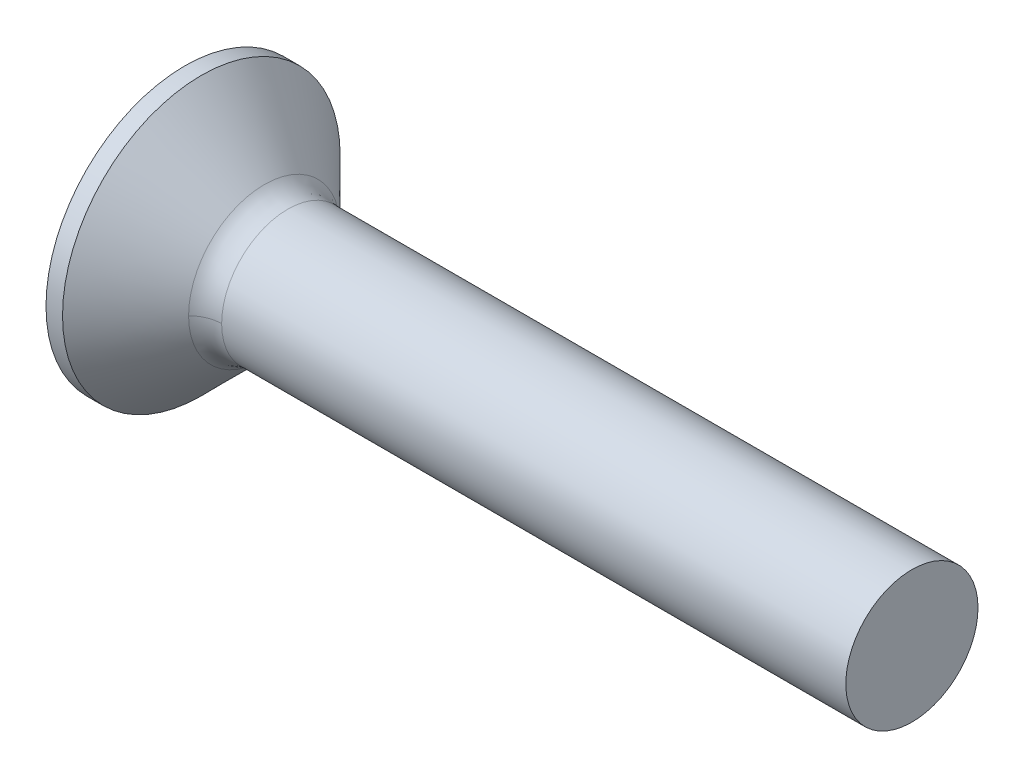
ISO-10303-21;
HEADER;
FILE_DESCRIPTION(('STEP AP214'),'2;1');
FILE_NAME('part.step','',(''),(''),'','','');
FILE_SCHEMA(('AUTOMOTIVE_DESIGN { 1 0 10303 214 1 1 1 1 }'));
ENDSEC;
DATA;
#1=APPLICATION_CONTEXT('core data for automotive mechanical design processes');
#2=APPLICATION_PROTOCOL_DEFINITION('international standard','automotive_design',2000,#1);
#3=PRODUCT_CONTEXT('',#1,'mechanical');
#4=PRODUCT('Part','Part','',(#3));
#5=PRODUCT_RELATED_PRODUCT_CATEGORY('part','',(#4));
#6=PRODUCT_DEFINITION_FORMATION('','',#4);
#7=PRODUCT_DEFINITION_CONTEXT('part definition',#1,'design');
#8=PRODUCT_DEFINITION('design','',#6,#7);
#9=PRODUCT_DEFINITION_SHAPE('','',#8);
#10=(LENGTH_UNIT() NAMED_UNIT(*) SI_UNIT(.MILLI.,.METRE.));
#11=(NAMED_UNIT(*) PLANE_ANGLE_UNIT() SI_UNIT($,.RADIAN.));
#12=(NAMED_UNIT(*) SI_UNIT($,.STERADIAN.) SOLID_ANGLE_UNIT());
#13=UNCERTAINTY_MEASURE_WITH_UNIT(LENGTH_MEASURE(1.E-05),#10,'distance_accuracy_value','');
#14=(GEOMETRIC_REPRESENTATION_CONTEXT(3) GLOBAL_UNCERTAINTY_ASSIGNED_CONTEXT((#13)) GLOBAL_UNIT_ASSIGNED_CONTEXT((#10,
#11,#12)) REPRESENTATION_CONTEXT('',''));
#15=CARTESIAN_POINT('',(0.,0.,0.));
#16=DIRECTION('',(0.,0.,1.));
#17=DIRECTION('',(1.,0.,0.));
#18=AXIS2_PLACEMENT_3D('',#15,#16,#17);
#19=CARTESIAN_POINT('',(25.,0.,0.));
#20=DIRECTION('',(-1.,0.,0.));
#21=DIRECTION('',(0.,0.,1.));
#22=AXIS2_PLACEMENT_3D('',#19,#20,#21);
#23=CYLINDRICAL_SURFACE('',#22,2.);
#24=CARTESIAN_POINT('',(3.11421356207373,0.,0.));
#25=DIRECTION('',(1.,0.,0.));
#26=DIRECTION('',(0.,1.,0.));
#27=AXIS2_PLACEMENT_3D('',#24,#25,#26);
#28=CIRCLE('',#27,2.00000000028272);
#29=CARTESIAN_POINT('',(3.11421356205332,-2.05103428515331E-10,-2.00000000021204));
#30=VERTEX_POINT('',#29);
#31=CARTESIAN_POINT('',(3.11421356207076,-8.9793628428733E-11,2.00000000021204));
#32=VERTEX_POINT('',#31);
#33=EDGE_CURVE('E358',#30,#32,#28,.T.);
#34=ORIENTED_EDGE('',*,*,#33,.T.);
#35=CARTESIAN_POINT('',(3.11421356207373,0.,0.));
#36=DIRECTION('',(1.,0.,0.));
#37=DIRECTION('',(0.,1.,0.));
#38=AXIS2_PLACEMENT_3D('',#35,#36,#37);
#39=CIRCLE('',#38,2.00000000028272);
#40=EDGE_CURVE('E347',#32,#30,#39,.T.);
#41=ORIENTED_EDGE('',*,*,#40,.T.);
#42=EDGE_LOOP('',(#34,#41));
#43=FACE_BOUND('',#42,.T.);
#44=CARTESIAN_POINT('',(22.,0.,0.));
#45=DIRECTION('',(1.,0.,0.));
#46=DIRECTION('',(0.,0.,-1.));
#47=AXIS2_PLACEMENT_3D('',#44,#45,#46);
#48=CIRCLE('',#47,2.);
#49=CARTESIAN_POINT('',(22.,0.,-2.));
#50=VERTEX_POINT('',#49);
#51=EDGE_CURVE('E34',#50,#50,#48,.T.);
#52=ORIENTED_EDGE('',*,*,#51,.F.);
#53=EDGE_LOOP('',(#52));
#54=FACE_BOUND('',#53,.T.);
#55=ADVANCED_FACE('F30',(#43,#54),#23,.T.);
#56=CARTESIAN_POINT('',(2.51,0.,0.));
#57=DIRECTION('',(-1.,0.,0.));
#58=DIRECTION('',(0.,0.,1.));
#59=AXIS2_PLACEMENT_3D('',#56,#57,#58);
#60=CONICAL_SURFACE('',#59,0.851,0.0698131700884116);
#61=CARTESIAN_POINT('',(2.51000000000001,0.,0.));
#62=DIRECTION('',(-1.,0.,0.));
#63=DIRECTION('',(0.,0.,1.));
#64=AXIS2_PLACEMENT_3D('',#61,#62,#63);
#65=CIRCLE('',#64,0.851);
#66=CARTESIAN_POINT('',(2.51000000000001,0.515000000128447,-0.677477674811281));
#67=VERTEX_POINT('',#66);
#68=CARTESIAN_POINT('',(2.50999999998821,0.677477674911375,-0.514999999998138));
#69=VERTEX_POINT('',#68);
#70=EDGE_CURVE('E140',#67,#69,#65,.F.);
#71=ORIENTED_EDGE('',*,*,#70,.T.);
#72=CARTESIAN_POINT('',(-7.25470712172385E-11,0.887981255320598,-0.514999999738052));
#73=CARTESIAN_POINT('',(0.318819879636719,0.862192153268574,-0.51499999990922));
#74=CARTESIAN_POINT('',(0.637620357667007,0.836153848252877,-0.514999999976439));
#75=CARTESIAN_POINT('',(1.27515765628023,0.783330183982056,-0.515000000023561));
#76=CARTESIAN_POINT('',(1.59389447718419,0.756544828595421,-0.515000000003464));
#77=CARTESIAN_POINT('',(2.01216629989946,0.720736675273492,-0.514999999998918));
#78=CARTESIAN_POINT('',(2.11173974714975,0.712163242481372,-0.514999999999459));
#79=CARTESIAN_POINT('',(2.31087725771429,0.694906260205415,-0.515000000000541));
#80=CARTESIAN_POINT('',(2.41044132101322,0.686222710544853,-0.515000000001082));
#81=CARTESIAN_POINT('',(2.50999999997648,0.677477674910992,-0.515));
#82=B_SPLINE_CURVE_WITH_KNOTS('',3,(#72,#73,#74,#75,#76,#77,#78,#79,#80,#81),.UNSPECIFIED.,.F.,
.F.,(4,2,2,2,4),(0.,0.959584754186786,1.91916454022962,2.21899005858181,2.51881605817835),.UNSPECIFIED.);
#83=CARTESIAN_POINT('',(0.,0.887981255466366,-0.515));
#84=VERTEX_POINT('',#83);
#85=EDGE_CURVE('E133',#84,#69,#82,.T.);
#86=ORIENTED_EDGE('',*,*,#85,.F.);
#87=CARTESIAN_POINT('',(0.,0.,0.));
#88=DIRECTION('',(-1.,0.,0.));
#89=DIRECTION('',(0.,0.,1.));
#90=AXIS2_PLACEMENT_3D('',#87,#88,#89);
#91=CIRCLE('',#90,1.026516298);
#92=CARTESIAN_POINT('',(-2.85935113966268E-11,0.515,-0.887981255468678));
#93=VERTEX_POINT('',#92);
#94=EDGE_CURVE('E144',#84,#93,#91,.T.);
#95=ORIENTED_EDGE('',*,*,#94,.T.);
#96=CARTESIAN_POINT('',(2.50999999998217,0.515,-0.677477674910489));
#97=CARTESIAN_POINT('',(2.24584461878122,0.515,-0.700667679814435));
#98=CARTESIAN_POINT('',(1.98165392257068,0.515,-0.723450461944113));
#99=CARTESIAN_POINT('',(1.45321766745748,0.515,-0.768360402906354));
#100=CARTESIAN_POINT('',(1.18897210874822,0.515,-0.79048756401168));
#101=CARTESIAN_POINT('',(0.770601353287124,0.515,-0.825124883970429));
#102=CARTESIAN_POINT('',(0.616489661388993,0.515,-0.837798921148617));
#103=CARTESIAN_POINT('',(0.308253737302725,0.515,-0.862997437699919));
#104=CARTESIAN_POINT('',(0.154129505090094,0.515,-0.875521916773493));
#105=CARTESIAN_POINT('',(-5.6932000135886E-11,0.515,-0.887981255470971));
#106=B_SPLINE_CURVE_WITH_KNOTS('',3,(#96,#97,#98,#99,#100,#101,#102,#103,#104,#105),
.UNSPECIFIED.,.F.,.F.,(4,2,2,2,4),(0.,0.795513110102209,1.59102346217274,2.05491931016661,
2.51881608711106),.UNSPECIFIED.);
#107=EDGE_CURVE('E166',#67,#93,#106,.T.);
#108=ORIENTED_EDGE('',*,*,#107,.F.);
#109=EDGE_LOOP('',(#71,#86,#95,#108));
#110=FACE_BOUND('',#109,.T.);
#111=ADVANCED_FACE('F154',(#110),#60,.F.);
#112=CARTESIAN_POINT('',(0.,0.668342541,-0.515));
#113=DIRECTION('',(0.,0.,1.));
#114=DIRECTION('',(1.,0.,0.));
#115=AXIS2_PLACEMENT_3D('',#112,#113,#114);
#116=PLANE('',#115);
#117=DIRECTION('',(0.,1.,0.));
#118=VECTOR('',#117,1.);
#119=CARTESIAN_POINT('',(2.51,1.4387388375,-0.515));
#120=LINE('',#119,#118);
#121=CARTESIAN_POINT('',(2.51,0.948560206845572,-0.515));
#122=VERTEX_POINT('',#121);
#123=EDGE_CURVE('E156',#69,#122,#120,.T.);
#124=ORIENTED_EDGE('',*,*,#123,.T.);
#125=DIRECTION('',(0.894934367754668,-0.446197800769517,0.));
#126=VECTOR('',#125,1.);
#127=CARTESIAN_POINT('',(1.255,1.5742801035,-0.515));
#128=LINE('',#127,#126);
#129=CARTESIAN_POINT('',(0.,2.19999999989061,-0.515));
#130=VERTEX_POINT('',#129);
#131=EDGE_CURVE('E137',#130,#122,#128,.T.);
#132=ORIENTED_EDGE('',*,*,#131,.F.);
#133=DIRECTION('',(0.,-1.,0.));
#134=VECTOR('',#133,1.);
#135=CARTESIAN_POINT('',(0.,1.4387388375,-0.515));
#136=LINE('',#135,#134);
#137=EDGE_CURVE('E128',#130,#84,#136,.T.);
#138=ORIENTED_EDGE('',*,*,#137,.T.);
#139=ORIENTED_EDGE('',*,*,#85,.T.);
#140=EDGE_LOOP('',(#124,#132,#138,#139));
#141=FACE_BOUND('',#140,.T.);
#142=ADVANCED_FACE('F131',(#141),#116,.T.);
#143=CARTESIAN_POINT('',(0.,0.515,-2.209135134));
#144=DIRECTION('',(0.,-1.,0.));
#145=DIRECTION('',(1.,0.,0.));
#146=AXIS2_PLACEMENT_3D('',#143,#144,#145);
#147=PLANE('',#146);
#148=DIRECTION('',(0.,0.,-1.));
#149=VECTOR('',#148,1.);
#150=CARTESIAN_POINT('',(0.,0.515,-1.4387388375));
#151=LINE('',#150,#149);
#152=CARTESIAN_POINT('',(0.,0.515,-2.19999999989061));
#153=VERTEX_POINT('',#152);
#154=EDGE_CURVE('E150',#93,#153,#151,.T.);
#155=ORIENTED_EDGE('',*,*,#154,.T.);
#156=DIRECTION('',(-0.894934367754668,0.,-0.446197800769517));
#157=VECTOR('',#156,1.);
#158=CARTESIAN_POINT('',(1.255,0.515,-1.5742801035));
#159=LINE('',#158,#157);
#160=CARTESIAN_POINT('',(2.51,0.515,-0.948560206845572));
#161=VERTEX_POINT('',#160);
#162=EDGE_CURVE('E378',#161,#153,#159,.T.);
#163=ORIENTED_EDGE('',*,*,#162,.F.);
#164=DIRECTION('',(0.,0.,1.));
#165=VECTOR('',#164,1.);
#166=CARTESIAN_POINT('',(2.51,0.515,-1.4387388375));
#167=LINE('',#166,#165);
#168=EDGE_CURVE('E158',#161,#67,#167,.T.);
#169=ORIENTED_EDGE('',*,*,#168,.T.);
#170=ORIENTED_EDGE('',*,*,#107,.T.);
#171=EDGE_LOOP('',(#155,#163,#169,#170));
#172=FACE_BOUND('',#171,.T.);
#173=ADVANCED_FACE('F653',(#172),#147,.T.);
#174=CARTESIAN_POINT('',(0.,2.2,-0.515));
#175=DIRECTION('',(-0.446197800769517,-0.894934367754668,0.));
#176=DIRECTION('',(0.894934367754668,-0.446197800769517,0.));
#177=AXIS2_PLACEMENT_3D('',#174,#175,#176);
#178=PLANE('',#177);
#179=ORIENTED_EDGE('',*,*,#131,.T.);
#180=DIRECTION('',(0.,0.,1.));
#181=VECTOR('',#180,1.);
#182=CARTESIAN_POINT('',(2.51,0.948560207,0.));
#183=LINE('',#182,#181);
#184=CARTESIAN_POINT('',(2.51,0.948560206768358,0.515));
#185=VERTEX_POINT('',#184);
#186=EDGE_CURVE('E394',#122,#185,#183,.T.);
#187=ORIENTED_EDGE('',*,*,#186,.T.);
#188=DIRECTION('',(0.894934367735432,-0.446197800808098,0.));
#189=VECTOR('',#188,1.);
#190=CARTESIAN_POINT('',(0.,2.19999999967182,0.515));
#191=LINE('',#190,#189);
#192=CARTESIAN_POINT('',(0.,2.19999999983591,0.515));
#193=VERTEX_POINT('',#192);
#194=EDGE_CURVE('E368',#193,#185,#191,.T.);
#195=ORIENTED_EDGE('',*,*,#194,.F.);
#196=DIRECTION('',(0.,0.,-1.));
#197=VECTOR('',#196,1.);
#198=CARTESIAN_POINT('',(0.,2.2,0.));
#199=LINE('',#198,#197);
#200=EDGE_CURVE('E389',#193,#130,#199,.T.);
#201=ORIENTED_EDGE('',*,*,#200,.T.);
#202=EDGE_LOOP('',(#179,#187,#195,#201));
#203=FACE_BOUND('',#202,.T.);
#204=ADVANCED_FACE('F525',(#203),#178,.T.);
#205=CARTESIAN_POINT('',(2.51,0.515,-0.948560207));
#206=DIRECTION('',(-0.446197800769517,0.,0.894934367754668));
#207=DIRECTION('',(-0.894934367754668,0.,-0.446197800769517));
#208=AXIS2_PLACEMENT_3D('',#205,#206,#207);
#209=PLANE('',#208);
#210=DIRECTION('',(-0.894934367735432,0.,-0.446197800808098));
#211=VECTOR('',#210,1.);
#212=CARTESIAN_POINT('',(2.51,-0.515,-0.948560206536716));
#213=LINE('',#212,#211);
#214=CARTESIAN_POINT('',(2.51,-0.515,-0.948560206768358));
#215=VERTEX_POINT('',#214);
#216=CARTESIAN_POINT('',(0.,-0.515,-2.19999999983591));
#217=VERTEX_POINT('',#216);
#218=EDGE_CURVE('E333',#215,#217,#213,.T.);
#219=ORIENTED_EDGE('',*,*,#218,.F.);
#220=DIRECTION('',(0.,1.,0.));
#221=VECTOR('',#220,1.);
#222=CARTESIAN_POINT('',(2.51,0.,-0.948560207));
#223=LINE('',#222,#221);
#224=EDGE_CURVE('E371',#215,#161,#223,.T.);
#225=ORIENTED_EDGE('',*,*,#224,.T.);
#226=ORIENTED_EDGE('',*,*,#162,.T.);
#227=DIRECTION('',(0.,-1.,0.));
#228=VECTOR('',#227,1.);
#229=CARTESIAN_POINT('',(0.,0.,-2.2));
#230=LINE('',#229,#228);
#231=EDGE_CURVE('E374',#153,#217,#230,.T.);
#232=ORIENTED_EDGE('',*,*,#231,.T.);
#233=EDGE_LOOP('',(#219,#225,#226,#232));
#234=FACE_BOUND('',#233,.T.);
#235=ADVANCED_FACE('F641',(#234),#209,.T.);
#236=CARTESIAN_POINT('',(0.,0.668342541,0.515));
#237=DIRECTION('',(0.,0.,-1.));
#238=DIRECTION('',(0.,1.,0.));
#239=AXIS2_PLACEMENT_3D('',#236,#237,#238);
#240=PLANE('',#239);
#241=DIRECTION('',(0.,1.,0.));
#242=VECTOR('',#241,1.);
#243=CARTESIAN_POINT('',(0.,1.4387388375,0.515));
#244=LINE('',#243,#242);
#245=CARTESIAN_POINT('',(0.,0.887981255466366,0.515));
#246=VERTEX_POINT('',#245);
#247=EDGE_CURVE('E363',#246,#193,#244,.T.);
#248=ORIENTED_EDGE('',*,*,#247,.T.);
#249=ORIENTED_EDGE('',*,*,#194,.T.);
#250=DIRECTION('',(0.,-1.,0.));
#251=VECTOR('',#250,1.);
#252=CARTESIAN_POINT('',(2.51,1.4387388375,0.515));
#253=LINE('',#252,#251);
#254=CARTESIAN_POINT('',(2.51000000000001,0.677477675015967,0.514999999859184));
#255=VERTEX_POINT('',#254);
#256=EDGE_CURVE('E369',#185,#255,#253,.T.);
#257=ORIENTED_EDGE('',*,*,#256,.T.);
#258=CARTESIAN_POINT('',(-6.23890795979364E-11,0.887981255359255,0.514999999806251));
#259=CARTESIAN_POINT('',(0.318819879644557,0.862192153281618,0.514999999932855));
#260=CARTESIAN_POINT('',(0.637620357673799,0.83615384825587,0.514999999982573));
#261=CARTESIAN_POINT('',(1.27515765628601,0.78333018397802,0.515000000017427));
#262=CARTESIAN_POINT('',(1.59389447719001,0.756544828594407,0.515000000002563));
#263=CARTESIAN_POINT('',(2.01216629990365,0.720736675273295,0.514999999999199));
#264=CARTESIAN_POINT('',(2.11173974715245,0.71216324248122,0.5149999999996));
#265=CARTESIAN_POINT('',(2.31087725771403,0.694906260205355,0.5150000000004));
#266=CARTESIAN_POINT('',(2.41044132101147,0.686222710544842,0.515000000000801));
#267=CARTESIAN_POINT('',(2.50999999997326,0.677477674911275,0.515));
#268=B_SPLINE_CURVE_WITH_KNOTS('',3,(#258,#259,#260,#261,#262,#263,#264,#265,#266,#267),
.UNSPECIFIED.,.F.,.F.,(4,2,2,2,4),(0.,0.959584754186115,1.91916454022833,2.21899005857607,
2.51881605816815),.UNSPECIFIED.);
#269=EDGE_CURVE('E215',#246,#255,#268,.T.);
#270=ORIENTED_EDGE('',*,*,#269,.F.);
#271=EDGE_LOOP('',(#248,#249,#257,#270));
#272=FACE_BOUND('',#271,.T.);
#273=ADVANCED_FACE('F188',(#272),#240,.T.);
#274=CARTESIAN_POINT('',(3.214046979,0.,2.004995835));
#275=CARTESIAN_POINT('',(3.214046979,4.009991669,2.004995835));
#276=CARTESIAN_POINT('',(3.214046979,4.009991669,-2.004995835));
#277=CARTESIAN_POINT('',(3.214046979,0.,-2.004995835));
#278=CARTESIAN_POINT('',(2.873263226,0.,1.970803409));
#279=CARTESIAN_POINT('',(2.873263226,3.941606817,1.970803409));
#280=CARTESIAN_POINT('',(2.873263226,3.941606817,-1.970803409));
#281=CARTESIAN_POINT('',(2.873263226,0.,-1.970803409));
#282=CARTESIAN_POINT('',(2.55683929,0.,2.101870494));
#283=CARTESIAN_POINT('',(2.55683929,4.203740989,2.101870494));
#284=CARTESIAN_POINT('',(2.55683929,4.203740989,-2.101870494));
#285=CARTESIAN_POINT('',(2.55683929,0.,-2.101870494));
#286=CARTESIAN_POINT('',(2.340046484,0.,2.367018693));
#287=CARTESIAN_POINT('',(2.340046484,4.734037387,2.367018693));
#288=CARTESIAN_POINT('',(2.340046484,4.734037387,-2.367018693));
#289=CARTESIAN_POINT('',(2.340046484,0.,-2.367018693));
#290=(BOUNDED_SURFACE() B_SPLINE_SURFACE(3,3,((#274,#275,#276,#277),(#278,#279,#280,#281),(#282,
#283,#284,#285),(#286,#287,#288,#289)),.UNSPECIFIED.,.F.,.F.,
.F.) B_SPLINE_SURFACE_WITH_KNOTS((4,4),(4,4),(0.,1.),(0.,1.),
.UNSPECIFIED.) GEOMETRIC_REPRESENTATION_ITEM() RATIONAL_B_SPLINE_SURFACE(((1.,0.333333333333333,
0.333333333333333,1.),(0.920706259011135,0.306902086337045,0.306902086337045,0.920706259011135),
(0.920706259011135,0.306902086337045,0.306902086337045,0.920706259011135),(1.,0.333333333333333,
0.333333333333333,1.))) REPRESENTATION_ITEM('') SURFACE());
#291=CARTESIAN_POINT('',(2.40710678099998,0.,0.));
#292=DIRECTION('',(-1.,0.,0.));
#293=DIRECTION('',(0.,0.,1.));
#294=AXIS2_PLACEMENT_3D('',#291,#292,#293);
#295=CIRCLE('',#294,2.292893219);
#296=CARTESIAN_POINT('',(2.40710678110323,-7.05420390654683E-10,-2.29289321882874));
#297=VERTEX_POINT('',#296);
#298=CARTESIAN_POINT('',(2.40710678096737,-2.05887201733649E-10,2.2928932189646));
#299=VERTEX_POINT('',#298);
#300=EDGE_CURVE('E319',#297,#299,#295,.F.);
#301=CARTESIAN_POINT('',(3.214046979,0.,2.004995835));
#302=CARTESIAN_POINT('',(2.873263226,0.,1.970803409));
#303=CARTESIAN_POINT('',(2.55683929,0.,2.101870494));
#304=CARTESIAN_POINT('',(2.340046484,0.,2.367018693));
#305=(BOUNDED_CURVE() B_SPLINE_CURVE(3,(#301,#302,#303,#304),.UNSPECIFIED.,.F.,
.F.) B_SPLINE_CURVE_WITH_KNOTS((4,4),(0.,1.),
.UNSPECIFIED.) CURVE() GEOMETRIC_REPRESENTATION_ITEM() RATIONAL_B_SPLINE_CURVE((1.,
0.920706259011135,0.920706259011135,1.)) REPRESENTATION_ITEM(''));
#306=EDGE_CURVE('E352',#299,#32,#305,.F.);
#307=CARTESIAN_POINT('',(3.214046979,0.,-2.004995835));
#308=CARTESIAN_POINT('',(2.873263226,0.,-1.970803409));
#309=CARTESIAN_POINT('',(2.55683929,0.,-2.101870494));
#310=CARTESIAN_POINT('',(2.340046484,0.,-2.367018693));
#311=(BOUNDED_CURVE() B_SPLINE_CURVE(3,(#307,#308,#309,#310),.UNSPECIFIED.,.F.,
.F.) B_SPLINE_CURVE_WITH_KNOTS((4,4),(0.,1.),
.UNSPECIFIED.) CURVE() GEOMETRIC_REPRESENTATION_ITEM() RATIONAL_B_SPLINE_CURVE((1.,
0.920706259011135,0.920706259011135,1.)) REPRESENTATION_ITEM(''));
#312=EDGE_CURVE('E338',#30,#297,#311,.T.);
#313=ORIENTED_EDGE('',*,*,#300,.T.);
#314=ORIENTED_EDGE('',*,*,#306,.T.);
#315=ORIENTED_EDGE('',*,*,#33,.F.);
#316=ORIENTED_EDGE('',*,*,#312,.T.);
#317=EDGE_LOOP('',(#313,#314,#315,#316));
#318=FACE_BOUND('',#317,.T.);
#319=ADVANCED_FACE('F182',(#318),#290,.F.);
#320=CARTESIAN_POINT('',(3.214046979,0.,-2.004995835));
#321=CARTESIAN_POINT('',(3.214046979,-4.009991669,-2.004995835));
#322=CARTESIAN_POINT('',(3.214046979,-4.009991669,2.004995835));
#323=CARTESIAN_POINT('',(3.214046979,0.,2.004995835));
#324=CARTESIAN_POINT('',(2.873263226,0.,-1.970803409));
#325=CARTESIAN_POINT('',(2.873263226,-3.941606817,-1.970803409));
#326=CARTESIAN_POINT('',(2.873263226,-3.941606817,1.970803409));
#327=CARTESIAN_POINT('',(2.873263226,0.,1.970803409));
#328=CARTESIAN_POINT('',(2.55683929,0.,-2.101870494));
#329=CARTESIAN_POINT('',(2.55683929,-4.203740989,-2.101870494));
#330=CARTESIAN_POINT('',(2.55683929,-4.203740989,2.101870494));
#331=CARTESIAN_POINT('',(2.55683929,0.,2.101870494));
#332=CARTESIAN_POINT('',(2.340046484,0.,-2.367018693));
#333=CARTESIAN_POINT('',(2.340046484,-4.734037387,-2.367018693));
#334=CARTESIAN_POINT('',(2.340046484,-4.734037387,2.367018693));
#335=CARTESIAN_POINT('',(2.340046484,0.,2.367018693));
#336=(BOUNDED_SURFACE() B_SPLINE_SURFACE(3,3,((#320,#321,#322,#323),(#324,#325,#326,#327),(#328,
#329,#330,#331),(#332,#333,#334,#335)),.UNSPECIFIED.,.F.,.F.,
.F.) B_SPLINE_SURFACE_WITH_KNOTS((4,4),(4,4),(0.,1.),(0.,1.),
.UNSPECIFIED.) GEOMETRIC_REPRESENTATION_ITEM() RATIONAL_B_SPLINE_SURFACE(((1.,0.333333333333333,
0.333333333333333,1.),(0.920706259011135,0.306902086337045,0.306902086337045,0.920706259011135),
(0.920706259011135,0.306902086337045,0.306902086337045,0.920706259011135),(1.,0.333333333333333,
0.333333333333333,1.))) REPRESENTATION_ITEM('') SURFACE());
#337=CARTESIAN_POINT('',(2.40710678099998,0.,0.));
#338=DIRECTION('',(-1.,0.,0.));
#339=DIRECTION('',(0.,0.,1.));
#340=AXIS2_PLACEMENT_3D('',#337,#338,#339);
#341=CIRCLE('',#340,2.292893219);
#342=EDGE_CURVE('E313',#299,#297,#341,.F.);
#343=ORIENTED_EDGE('',*,*,#312,.F.);
#344=ORIENTED_EDGE('',*,*,#40,.F.);
#345=ORIENTED_EDGE('',*,*,#306,.F.);
#346=ORIENTED_EDGE('',*,*,#342,.T.);
#347=EDGE_LOOP('',(#343,#344,#345,#346));
#348=FACE_BOUND('',#347,.T.);
#349=ADVANCED_FACE('F187',(#348),#336,.F.);
#350=CARTESIAN_POINT('',(0.,-0.515,-2.209135134));
#351=DIRECTION('',(0.,1.,0.));
#352=DIRECTION('',(0.,0.,1.));
#353=AXIS2_PLACEMENT_3D('',#350,#351,#352);
#354=PLANE('',#353);
#355=DIRECTION('',(0.,0.,-1.));
#356=VECTOR('',#355,1.);
#357=CARTESIAN_POINT('',(2.51,-0.515,-1.4387388375));
#358=LINE('',#357,#356);
#359=CARTESIAN_POINT('',(2.51000000000001,-0.515000000067614,-0.677477674857525));
#360=VERTEX_POINT('',#359);
#361=EDGE_CURVE('E334',#360,#215,#358,.T.);
#362=ORIENTED_EDGE('',*,*,#361,.T.);
#363=ORIENTED_EDGE('',*,*,#218,.T.);
#364=DIRECTION('',(0.,0.,1.));
#365=VECTOR('',#364,1.);
#366=CARTESIAN_POINT('',(0.,-0.515,-1.4387388375));
#367=LINE('',#366,#365);
#368=CARTESIAN_POINT('',(-2.98730558439721E-11,-0.515,-0.887981255468781));
#369=VERTEX_POINT('',#368);
#370=EDGE_CURVE('E336',#217,#369,#367,.T.);
#371=ORIENTED_EDGE('',*,*,#370,.T.);
#372=CARTESIAN_POINT('',(2.50999999998707,-0.515,-0.677477674910059));
#373=CARTESIAN_POINT('',(2.24584461878623,-0.515,-0.700667679814001));
#374=CARTESIAN_POINT('',(1.98165392257579,-0.515,-0.723450461943674));
#375=CARTESIAN_POINT('',(1.45321766746281,-0.515,-0.768360402905906));
#376=CARTESIAN_POINT('',(1.18897210875365,-0.515,-0.790487564011227));
#377=CARTESIAN_POINT('',(0.77060135329132,-0.515,-0.825124883970084));
#378=CARTESIAN_POINT('',(0.616489661391847,-0.515,-0.837798921148383));
#379=CARTESIAN_POINT('',(0.308253737302892,-0.515,-0.862997437699906));
#380=CARTESIAN_POINT('',(0.154129505088917,-0.515,-0.875521916773589));
#381=CARTESIAN_POINT('',(-5.94528920877672E-11,-0.515,-0.887981255471175));
#382=B_SPLINE_CURVE_WITH_KNOTS('',3,(#372,#373,#374,#375,#376,#377,#378,#379,#380,#381),
.UNSPECIFIED.,.F.,.F.,(4,2,2,2,4),(0.,0.795513110101889,1.5910234621721,2.05491931017002,
2.5188160871185),.UNSPECIFIED.);
#383=EDGE_CURVE('E305',#360,#369,#382,.T.);
#384=ORIENTED_EDGE('',*,*,#383,.F.);
#385=EDGE_LOOP('',(#362,#363,#371,#384));
#386=FACE_BOUND('',#385,.T.);
#387=ADVANCED_FACE('F199',(#386),#354,.T.);
#388=CARTESIAN_POINT('',(2.51,0.,0.));
#389=DIRECTION('',(-1.,0.,0.));
#390=DIRECTION('',(0.,0.,1.));
#391=AXIS2_PLACEMENT_3D('',#388,#389,#390);
#392=CONICAL_SURFACE('',#391,0.851,0.0698131700884116);
#393=CARTESIAN_POINT('',(0.,0.,0.));
#394=DIRECTION('',(-1.,0.,0.));
#395=DIRECTION('',(0.,0.,1.));
#396=AXIS2_PLACEMENT_3D('',#393,#394,#395);
#397=CIRCLE('',#396,1.026516298);
#398=CARTESIAN_POINT('',(0.,0.515,0.887981255466366));
#399=VERTEX_POINT('',#398);
#400=EDGE_CURVE('E332',#399,#246,#397,.T.);
#401=ORIENTED_EDGE('',*,*,#400,.T.);
#402=ORIENTED_EDGE('',*,*,#269,.T.);
#403=CARTESIAN_POINT('',(2.51000000000001,0.,0.));
#404=DIRECTION('',(-1.,0.,0.));
#405=DIRECTION('',(0.,0.,1.));
#406=AXIS2_PLACEMENT_3D('',#403,#404,#405);
#407=CIRCLE('',#406,0.851);
#408=CARTESIAN_POINT('',(2.50999999998668,0.514999999928661,0.677477674964324));
#409=VERTEX_POINT('',#408);
#410=EDGE_CURVE('E329',#255,#409,#407,.F.);
#411=ORIENTED_EDGE('',*,*,#410,.T.);
#412=CARTESIAN_POINT('',(-6.26901258969882E-11,0.514999999808638,0.887981255360661));
#413=CARTESIAN_POINT('',(0.31881987964419,0.514999999933682,0.862192153282127));
#414=CARTESIAN_POINT('',(0.637620357673408,0.514999999982788,0.836153848256026));
#415=CARTESIAN_POINT('',(1.27515765628561,0.515000000017212,0.783330183977929));
#416=CARTESIAN_POINT('',(1.59389447718963,0.515000000002531,0.756544828594421));
#417=CARTESIAN_POINT('',(2.01216629990336,0.514999999999209,0.720736675273325));
#418=CARTESIAN_POINT('',(2.11173974715225,0.514999999999605,0.712163242481241));
#419=CARTESIAN_POINT('',(2.31087725771398,0.515000000000395,0.694906260205356));
#420=CARTESIAN_POINT('',(2.41044132101151,0.515000000000791,0.686222710544833));
#421=CARTESIAN_POINT('',(2.50999999997338,0.515,0.677477674911264));
#422=B_SPLINE_CURVE_WITH_KNOTS('',3,(#412,#413,#414,#415,#416,#417,#418,#419,#420,#421),
.UNSPECIFIED.,.F.,.F.,(4,2,2,2,4),(0.,0.959584754186134,1.91916454022837,2.21899005857636,
2.51881605816869),.UNSPECIFIED.);
#423=EDGE_CURVE('E223',#399,#409,#422,.T.);
#424=ORIENTED_EDGE('',*,*,#423,.F.);
#425=EDGE_LOOP('',(#401,#402,#411,#424));
#426=FACE_BOUND('',#425,.T.);
#427=ADVANCED_FACE('F201',(#426),#392,.F.);
#428=CARTESIAN_POINT('',(2.407106781,0.,0.));
#429=DIRECTION('',(-1.,0.,0.));
#430=DIRECTION('',(0.,0.,1.));
#431=AXIS2_PLACEMENT_3D('',#428,#429,#430);
#432=CONICAL_SURFACE('',#431,2.292893219,0.785398163397448);
#433=ORIENTED_EDGE('',*,*,#342,.F.);
#434=ORIENTED_EDGE('',*,*,#300,.F.);
#435=EDGE_LOOP('',(#433,#434));
#436=FACE_BOUND('',#435,.T.);
#437=CARTESIAN_POINT('',(0.5,0.,0.));
#438=DIRECTION('',(-1.,0.,0.));
#439=DIRECTION('',(0.,0.,1.));
#440=AXIS2_PLACEMENT_3D('',#437,#438,#439);
#441=CIRCLE('',#440,4.2);
#442=CARTESIAN_POINT('',(0.5,0.,4.2));
#443=VERTEX_POINT('',#442);
#444=EDGE_CURVE('E325',#443,#443,#441,.F.);
#445=ORIENTED_EDGE('',*,*,#444,.T.);
#446=EDGE_LOOP('',(#445));
#447=FACE_BOUND('',#446,.T.);
#448=ADVANCED_FACE('F210',(#436,#447),#432,.T.);
#449=CARTESIAN_POINT('',(2.51,0.,0.));
#450=DIRECTION('',(-1.,0.,0.));
#451=DIRECTION('',(0.,0.,1.));
#452=AXIS2_PLACEMENT_3D('',#449,#450,#451);
#453=CONICAL_SURFACE('',#452,0.851,0.0698131700884116);
#454=CARTESIAN_POINT('',(0.,0.,0.));
#455=DIRECTION('',(-1.,0.,0.));
#456=DIRECTION('',(0.,0.,1.));
#457=AXIS2_PLACEMENT_3D('',#454,#455,#456);
#458=CIRCLE('',#457,1.026516298);
#459=CARTESIAN_POINT('',(0.,-0.887981256473654,-0.514999998263199));
#460=VERTEX_POINT('',#459);
#461=EDGE_CURVE('E239',#369,#460,#458,.T.);
#462=ORIENTED_EDGE('',*,*,#461,.T.);
#463=CARTESIAN_POINT('',(2.5099999999791,-0.677477674910759,-0.515));
#464=CARTESIAN_POINT('',(2.24584461877809,-0.700667679814707,-0.515));
#465=CARTESIAN_POINT('',(1.98165392256748,-0.723450461944388,-0.515));
#466=CARTESIAN_POINT('',(1.45321766745415,-0.768360402906635,-0.515));
#467=CARTESIAN_POINT('',(1.18897210874481,-0.790487564011964,-0.515));
#468=CARTESIAN_POINT('',(0.770601353275102,-0.825124883971423,-0.515));
#469=CARTESIAN_POINT('',(0.616489661368421,-0.837798921150308,-0.515));
#470=CARTESIAN_POINT('',(0.308253737265049,-0.862997437702989,-0.515));
#471=CARTESIAN_POINT('',(0.154129505043866,-0.875521916777246,-0.515));
#472=CARTESIAN_POINT('',(-1.11713501698456E-10,-0.887981255475399,-0.515));
#473=B_SPLINE_CURVE_WITH_KNOTS('',3,(#463,#464,#465,#466,#467,#468,#469,#470,#471,#472),
.UNSPECIFIED.,.F.,.F.,(4,2,2,2,4),(0.,0.79551311010241,1.59102346217314,2.05491931019275,
2.51881608716294),.UNSPECIFIED.);
#474=CARTESIAN_POINT('',(2.51000000000001,-0.677477674864095,-0.51500000005897));
#475=VERTEX_POINT('',#474);
#476=EDGE_CURVE('E233',#475,#460,#473,.T.);
#477=ORIENTED_EDGE('',*,*,#476,.F.);
#478=CARTESIAN_POINT('',(2.51000000000001,0.,0.));
#479=DIRECTION('',(-1.,0.,0.));
#480=DIRECTION('',(0.,0.,1.));
#481=AXIS2_PLACEMENT_3D('',#478,#479,#480);
#482=CIRCLE('',#481,0.851);
#483=EDGE_CURVE('E310',#475,#360,#482,.F.);
#484=ORIENTED_EDGE('',*,*,#483,.T.);
#485=ORIENTED_EDGE('',*,*,#383,.T.);
#486=EDGE_LOOP('',(#462,#477,#484,#485));
#487=FACE_BOUND('',#486,.T.);
#488=ADVANCED_FACE('F245',(#487),#453,.F.);
#489=CARTESIAN_POINT('',(0.,0.515,0.668342541));
#490=DIRECTION('',(0.,-1.,0.));
#491=DIRECTION('',(1.,0.,0.));
#492=AXIS2_PLACEMENT_3D('',#489,#490,#491);
#493=PLANE('',#492);
#494=DIRECTION('',(0.,0.,1.));
#495=VECTOR('',#494,1.);
#496=CARTESIAN_POINT('',(2.51,0.515,1.4387388375));
#497=LINE('',#496,#495);
#498=CARTESIAN_POINT('',(2.51,0.515,0.948560206845572));
#499=VERTEX_POINT('',#498);
#500=EDGE_CURVE('E231',#409,#499,#497,.T.);
#501=ORIENTED_EDGE('',*,*,#500,.T.);
#502=DIRECTION('',(0.894934367754668,0.,-0.446197800769517));
#503=VECTOR('',#502,1.);
#504=CARTESIAN_POINT('',(1.255,0.515,1.5742801035));
#505=LINE('',#504,#503);
#506=CARTESIAN_POINT('',(-1.78042765715721E-10,0.514999998842133,2.20000000042524));
#507=VERTEX_POINT('',#506);
#508=EDGE_CURVE('E469',#507,#499,#505,.T.);
#509=ORIENTED_EDGE('',*,*,#508,.F.);
#510=DIRECTION('',(0.,0.,-1.));
#511=VECTOR('',#510,1.);
#512=CARTESIAN_POINT('',(0.,0.515,1.4387388375));
#513=LINE('',#512,#511);
#514=EDGE_CURVE('E232',#507,#399,#513,.T.);
#515=ORIENTED_EDGE('',*,*,#514,.T.);
#516=ORIENTED_EDGE('',*,*,#423,.T.);
#517=EDGE_LOOP('',(#501,#509,#515,#516));
#518=FACE_BOUND('',#517,.T.);
#519=ADVANCED_FACE('F240',(#518),#493,.T.);
#520=CARTESIAN_POINT('',(0.5,0.,0.));
#521=DIRECTION('',(-1.,0.,0.));
#522=DIRECTION('',(0.,0.,1.));
#523=AXIS2_PLACEMENT_3D('',#520,#521,#522);
#524=CYLINDRICAL_SURFACE('',#523,4.2);
#525=ORIENTED_EDGE('',*,*,#444,.F.);
#526=EDGE_LOOP('',(#525));
#527=FACE_BOUND('',#526,.T.);
#528=CARTESIAN_POINT('',(0.,0.,0.));
#529=DIRECTION('',(-1.,0.,0.));
#530=DIRECTION('',(0.,0.,1.));
#531=AXIS2_PLACEMENT_3D('',#528,#529,#530);
#532=CIRCLE('',#531,4.2);
#533=CARTESIAN_POINT('',(0.,0.,4.2));
#534=VERTEX_POINT('',#533);
#535=EDGE_CURVE('E468',#534,#534,#532,.T.);
#536=ORIENTED_EDGE('',*,*,#535,.F.);
#537=EDGE_LOOP('',(#536));
#538=FACE_BOUND('',#537,.T.);
#539=ADVANCED_FACE('F244',(#527,#538),#524,.T.);
#540=CARTESIAN_POINT('',(0.,-2.209135134,-0.515));
#541=DIRECTION('',(0.,0.,1.));
#542=DIRECTION('',(1.,0.,0.));
#543=AXIS2_PLACEMENT_3D('',#540,#541,#542);
#544=PLANE('',#543);
#545=DIRECTION('',(0.,1.,0.));
#546=VECTOR('',#545,1.);
#547=CARTESIAN_POINT('',(0.,0.,-0.514999996526399));
#548=LINE('',#547,#546);
#549=CARTESIAN_POINT('',(0.,-2.20000000044587,-0.514999998842133));
#550=VERTEX_POINT('',#549);
#551=EDGE_CURVE('E457',#550,#460,#548,.T.);
#552=ORIENTED_EDGE('',*,*,#551,.F.);
#553=DIRECTION('',(-0.894934367754668,-0.446197800769517,0.));
#554=VECTOR('',#553,1.);
#555=CARTESIAN_POINT('',(1.255,-1.5742801035,-0.515));
#556=LINE('',#555,#554);
#557=CARTESIAN_POINT('',(2.51,-0.948560206845572,-0.515));
#558=VERTEX_POINT('',#557);
#559=EDGE_CURVE('E454',#558,#550,#556,.T.);
#560=ORIENTED_EDGE('',*,*,#559,.F.);
#561=DIRECTION('',(0.,1.,0.));
#562=VECTOR('',#561,1.);
#563=CARTESIAN_POINT('',(2.51,-1.4387388375,-0.515));
#564=LINE('',#563,#562);
#565=EDGE_CURVE('E328',#558,#475,#564,.T.);
#566=ORIENTED_EDGE('',*,*,#565,.T.);
#567=ORIENTED_EDGE('',*,*,#476,.T.);
#568=EDGE_LOOP('',(#552,#560,#566,#567));
#569=FACE_BOUND('',#568,.T.);
#570=ADVANCED_FACE('F248',(#569),#544,.T.);
#571=CARTESIAN_POINT('',(0.,0.515,2.2));
#572=DIRECTION('',(-0.446197800769517,0.,-0.894934367754668));
#573=DIRECTION('',(0.894934367754668,0.,-0.446197800769517));
#574=AXIS2_PLACEMENT_3D('',#571,#572,#573);
#575=PLANE('',#574);
#576=ORIENTED_EDGE('',*,*,#508,.T.);
#577=DIRECTION('',(0.,-1.,0.));
#578=VECTOR('',#577,1.);
#579=CARTESIAN_POINT('',(2.51,0.,0.948560207));
#580=LINE('',#579,#578);
#581=CARTESIAN_POINT('',(2.51,-0.515,0.948560206768358));
#582=VERTEX_POINT('',#581);
#583=EDGE_CURVE('E466',#499,#582,#580,.T.);
#584=ORIENTED_EDGE('',*,*,#583,.T.);
#585=DIRECTION('',(0.894934367735432,0.,-0.446197800808098));
#586=VECTOR('',#585,1.);
#587=CARTESIAN_POINT('',(0.,-0.515,2.19999999967182));
#588=LINE('',#587,#586);
#589=CARTESIAN_POINT('',(0.,-0.515,2.20000000050471));
#590=VERTEX_POINT('',#589);
#591=EDGE_CURVE('E437',#590,#582,#588,.T.);
#592=ORIENTED_EDGE('',*,*,#591,.F.);
#593=DIRECTION('',(0.,-1.,0.));
#594=VECTOR('',#593,1.);
#595=CARTESIAN_POINT('',(0.,0.,2.2000000013376));
#596=LINE('',#595,#594);
#597=EDGE_CURVE('E460',#507,#590,#596,.T.);
#598=ORIENTED_EDGE('',*,*,#597,.F.);
#599=EDGE_LOOP('',(#576,#584,#592,#598));
#600=FACE_BOUND('',#599,.T.);
#601=ADVANCED_FACE('F252',(#600),#575,.T.);
#602=CARTESIAN_POINT('',(0.,-4.2504,-4.2504));
#603=DIRECTION('',(-1.,0.,0.));
#604=DIRECTION('',(0.,0.,1.));
#605=AXIS2_PLACEMENT_3D('',#602,#603,#604);
#606=PLANE('',#605);
#607=ORIENTED_EDGE('',*,*,#514,.F.);
#608=ORIENTED_EDGE('',*,*,#597,.T.);
#609=DIRECTION('',(0.,0.,1.));
#610=VECTOR('',#609,1.);
#611=CARTESIAN_POINT('',(0.,-0.515,1.4387388375));
#612=LINE('',#611,#610);
#613=CARTESIAN_POINT('',(0.,-0.515,0.887981255466366));
#614=VERTEX_POINT('',#613);
#615=EDGE_CURVE('E439',#614,#590,#612,.T.);
#616=ORIENTED_EDGE('',*,*,#615,.F.);
#617=CARTESIAN_POINT('',(0.,0.,0.));
#618=DIRECTION('',(-1.,0.,0.));
#619=DIRECTION('',(0.,0.,1.));
#620=AXIS2_PLACEMENT_3D('',#617,#618,#619);
#621=CIRCLE('',#620,1.026516298);
#622=CARTESIAN_POINT('',(0.,-0.887981255466366,0.515));
#623=VERTEX_POINT('',#622);
#624=EDGE_CURVE('E425',#614,#623,#621,.F.);
#625=ORIENTED_EDGE('',*,*,#624,.T.);
#626=DIRECTION('',(0.,1.,0.));
#627=VECTOR('',#626,1.);
#628=CARTESIAN_POINT('',(0.,-1.4387388375,0.515));
#629=LINE('',#628,#627);
#630=CARTESIAN_POINT('',(0.,-2.19999999983591,0.515));
#631=VERTEX_POINT('',#630);
#632=EDGE_CURVE('E433',#631,#623,#629,.T.);
#633=ORIENTED_EDGE('',*,*,#632,.F.);
#634=DIRECTION('',(0.,0.,1.));
#635=VECTOR('',#634,1.);
#636=CARTESIAN_POINT('',(0.,-2.2,0.));
#637=LINE('',#636,#635);
#638=EDGE_CURVE('E450',#550,#631,#637,.T.);
#639=ORIENTED_EDGE('',*,*,#638,.F.);
#640=ORIENTED_EDGE('',*,*,#551,.T.);
#641=ORIENTED_EDGE('',*,*,#461,.F.);
#642=ORIENTED_EDGE('',*,*,#370,.F.);
#643=ORIENTED_EDGE('',*,*,#231,.F.);
#644=ORIENTED_EDGE('',*,*,#154,.F.);
#645=ORIENTED_EDGE('',*,*,#94,.F.);
#646=ORIENTED_EDGE('',*,*,#137,.F.);
#647=ORIENTED_EDGE('',*,*,#200,.F.);
#648=ORIENTED_EDGE('',*,*,#247,.F.);
#649=ORIENTED_EDGE('',*,*,#400,.F.);
#650=EDGE_LOOP('',(#607,#608,#616,#625,#633,#639,#640,#641,#642,#643,#644,#645,#646,#647,#648,#649));
#651=FACE_BOUND('',#650,.T.);
#652=ORIENTED_EDGE('',*,*,#535,.T.);
#653=EDGE_LOOP('',(#652));
#654=FACE_BOUND('',#653,.T.);
#655=ADVANCED_FACE('F146',(#651,#654),#606,.T.);
#656=CARTESIAN_POINT('',(2.51,-0.948560207,-0.515));
#657=DIRECTION('',(-0.446197800769517,0.894934367754668,0.));
#658=DIRECTION('',(-0.894934367754668,-0.446197800769517,0.));
#659=AXIS2_PLACEMENT_3D('',#656,#657,#658);
#660=PLANE('',#659);
#661=DIRECTION('',(-0.894934367735432,-0.446197800808098,0.));
#662=VECTOR('',#661,1.);
#663=CARTESIAN_POINT('',(2.51,-0.948560206536716,0.515));
#664=LINE('',#663,#662);
#665=CARTESIAN_POINT('',(2.51,-0.948560206768358,0.515));
#666=VERTEX_POINT('',#665);
#667=EDGE_CURVE('E435',#666,#631,#664,.T.);
#668=ORIENTED_EDGE('',*,*,#667,.F.);
#669=DIRECTION('',(0.,0.,-1.));
#670=VECTOR('',#669,1.);
#671=CARTESIAN_POINT('',(2.51,-0.948560207,0.));
#672=LINE('',#671,#670);
#673=EDGE_CURVE('E447',#666,#558,#672,.T.);
#674=ORIENTED_EDGE('',*,*,#673,.T.);
#675=ORIENTED_EDGE('',*,*,#559,.T.);
#676=ORIENTED_EDGE('',*,*,#638,.T.);
#677=EDGE_LOOP('',(#668,#674,#675,#676));
#678=FACE_BOUND('',#677,.T.);
#679=ADVANCED_FACE('F259',(#678),#660,.T.);
#680=CARTESIAN_POINT('',(2.51,0.67585118,-0.515));
#681=DIRECTION('',(-1.,0.,0.));
#682=DIRECTION('',(0.,0.,1.));
#683=AXIS2_PLACEMENT_3D('',#680,#681,#682);
#684=PLANE('',#683);
#685=ORIENTED_EDGE('',*,*,#256,.F.);
#686=ORIENTED_EDGE('',*,*,#186,.F.);
#687=ORIENTED_EDGE('',*,*,#123,.F.);
#688=CARTESIAN_POINT('',(2.51,0.,0.));
#689=DIRECTION('',(-1.,0.,0.));
#690=DIRECTION('',(0.,0.,1.));
#691=AXIS2_PLACEMENT_3D('',#688,#689,#690);
#692=CIRCLE('',#691,0.851);
#693=EDGE_CURVE('E288',#255,#69,#692,.T.);
#694=ORIENTED_EDGE('',*,*,#693,.F.);
#695=EDGE_LOOP('',(#685,#686,#687,#694));
#696=FACE_BOUND('',#695,.T.);
#697=ADVANCED_FACE('F262',(#696),#684,.T.);
#698=CARTESIAN_POINT('',(0.,-0.515,0.668342541));
#699=DIRECTION('',(0.,1.,0.));
#700=DIRECTION('',(0.,0.,1.));
#701=AXIS2_PLACEMENT_3D('',#698,#699,#700);
#702=PLANE('',#701);
#703=ORIENTED_EDGE('',*,*,#615,.T.);
#704=ORIENTED_EDGE('',*,*,#591,.T.);
#705=DIRECTION('',(0.,0.,-1.));
#706=VECTOR('',#705,1.);
#707=CARTESIAN_POINT('',(2.51,-0.515,1.4387388375));
#708=LINE('',#707,#706);
#709=CARTESIAN_POINT('',(2.50999999999095,-0.514999999989494,0.677477674917705));
#710=VERTEX_POINT('',#709);
#711=EDGE_CURVE('E49',#582,#710,#708,.T.);
#712=ORIENTED_EDGE('',*,*,#711,.T.);
#713=CARTESIAN_POINT('',(-7.7649088548156E-11,-0.514999999696975,0.887981255297232));
#714=CARTESIAN_POINT('',(0.318819879632992,-0.514999999894984,0.862192153260636));
#715=CARTESIAN_POINT('',(0.637620357663888,-0.514999999972744,0.836153848250993));
#716=CARTESIAN_POINT('',(1.27515765627767,-0.515000000027256,0.783330183984409));
#717=CARTESIAN_POINT('',(1.59389447718159,-0.515000000004008,0.756544828595956));
#718=CARTESIAN_POINT('',(2.01216629989826,-0.514999999998748,0.720736675273497));
#719=CARTESIAN_POINT('',(2.11173974714989,-0.514999999999374,0.712163242481311));
#720=CARTESIAN_POINT('',(2.31087725771711,-0.515000000000626,0.694906260205219));
#721=CARTESIAN_POINT('',(2.41044132101739,-0.515000000001252,0.686222710544588));
#722=CARTESIAN_POINT('',(2.50999999998197,-0.515,0.67747767491051));
#723=B_SPLINE_CURVE_WITH_KNOTS('',3,(#713,#714,#715,#716,#717,#718,#719,#720,#721,#722),
.UNSPECIFIED.,.F.,.F.,(4,2,2,2,4),(0.,0.959584754187123,1.91916454023027,2.21899005858648,
2.51881605818705),.UNSPECIFIED.);
#724=EDGE_CURVE('E275',#614,#710,#723,.T.);
#725=ORIENTED_EDGE('',*,*,#724,.F.);
#726=EDGE_LOOP('',(#703,#704,#712,#725));
#727=FACE_BOUND('',#726,.T.);
#728=ADVANCED_FACE('F266',(#727),#702,.T.);
#729=CARTESIAN_POINT('',(0.,-2.209135134,0.515));
#730=DIRECTION('',(0.,0.,-1.));
#731=DIRECTION('',(0.,1.,0.));
#732=AXIS2_PLACEMENT_3D('',#729,#730,#731);
#733=PLANE('',#732);
#734=DIRECTION('',(0.,1.,0.));
#735=VECTOR('',#734,1.);
#736=CARTESIAN_POINT('',(2.51,-0.8122056935,0.515));
#737=LINE('',#736,#735);
#738=CARTESIAN_POINT('',(2.50999999999626,-0.677477674805039,0.51500000013709));
#739=VERTEX_POINT('',#738);
#740=EDGE_CURVE('E283',#666,#739,#737,.T.);
#741=ORIENTED_EDGE('',*,*,#740,.F.);
#742=ORIENTED_EDGE('',*,*,#667,.T.);
#743=ORIENTED_EDGE('',*,*,#632,.T.);
#744=CARTESIAN_POINT('',(2.50999999999252,-0.67747767490958,0.515));
#745=CARTESIAN_POINT('',(2.2458446187918,-0.700667679813517,0.515));
#746=CARTESIAN_POINT('',(1.98165392258148,-0.723450461943186,0.515));
#747=CARTESIAN_POINT('',(1.45321766746874,-0.768360402905407,0.515));
#748=CARTESIAN_POINT('',(1.1889721087597,-0.790487564010722,0.515));
#749=CARTESIAN_POINT('',(0.770601353297018,-0.825124883969614,0.515));
#750=CARTESIAN_POINT('',(0.616489661397075,-0.837798921147954,0.515));
#751=CARTESIAN_POINT('',(0.308253737307182,-0.862997437699557,0.515));
#752=CARTESIAN_POINT('',(0.154129505092738,-0.875521916773279,0.515));
#753=CARTESIAN_POINT('',(-5.61004891926854E-11,-0.887981255470903,0.515));
#754=B_SPLINE_CURVE_WITH_KNOTS('',3,(#744,#745,#746,#747,#748,#749,#750,#751,#752,#753),
.UNSPECIFIED.,.F.,.F.,(4,2,2,2,4),(0.,0.795513110101533,1.59102346217139,2.05491931017072,
2.51881608712061),.UNSPECIFIED.);
#755=EDGE_CURVE('E282',#739,#623,#754,.T.);
#756=ORIENTED_EDGE('',*,*,#755,.F.);
#757=EDGE_LOOP('',(#741,#742,#743,#756));
#758=FACE_BOUND('',#757,.T.);
#759=ADVANCED_FACE('F271',(#758),#733,.T.);
#760=CARTESIAN_POINT('',(2.51,-0.515,-0.948560207));
#761=DIRECTION('',(-1.,0.,0.));
#762=DIRECTION('',(0.,0.,1.));
#763=AXIS2_PLACEMENT_3D('',#760,#761,#762);
#764=PLANE('',#763);
#765=ORIENTED_EDGE('',*,*,#168,.F.);
#766=ORIENTED_EDGE('',*,*,#224,.F.);
#767=ORIENTED_EDGE('',*,*,#361,.F.);
#768=CARTESIAN_POINT('',(2.51000000000001,0.,0.));
#769=DIRECTION('',(-1.,0.,0.));
#770=DIRECTION('',(0.,0.,1.));
#771=AXIS2_PLACEMENT_3D('',#768,#769,#770);
#772=CIRCLE('',#771,0.850999999999961);
#773=EDGE_CURVE('E419',#67,#360,#772,.T.);
#774=ORIENTED_EDGE('',*,*,#773,.F.);
#775=EDGE_LOOP('',(#765,#766,#767,#774));
#776=FACE_BOUND('',#775,.T.);
#777=ADVANCED_FACE('F567',(#776),#764,.T.);
#778=CARTESIAN_POINT('',(2.51,-0.948560207,-0.515));
#779=DIRECTION('',(-1.,0.,0.));
#780=DIRECTION('',(0.,0.,1.));
#781=AXIS2_PLACEMENT_3D('',#778,#779,#780);
#782=PLANE('',#781);
#783=ORIENTED_EDGE('',*,*,#565,.F.);
#784=ORIENTED_EDGE('',*,*,#673,.F.);
#785=ORIENTED_EDGE('',*,*,#740,.T.);
#786=CARTESIAN_POINT('',(2.51,0.,0.));
#787=DIRECTION('',(-1.,0.,0.));
#788=DIRECTION('',(0.,0.,1.));
#789=AXIS2_PLACEMENT_3D('',#786,#787,#788);
#790=CIRCLE('',#789,0.851);
#791=EDGE_CURVE('E417',#475,#739,#790,.T.);
#792=ORIENTED_EDGE('',*,*,#791,.F.);
#793=EDGE_LOOP('',(#783,#784,#785,#792));
#794=FACE_BOUND('',#793,.T.);
#795=ADVANCED_FACE('F295',(#794),#782,.T.);
#796=CARTESIAN_POINT('',(2.51,0.,0.));
#797=DIRECTION('',(-1.,0.,0.));
#798=DIRECTION('',(0.,0.,1.));
#799=AXIS2_PLACEMENT_3D('',#796,#797,#798);
#800=CONICAL_SURFACE('',#799,0.851,0.0698131700884116);
#801=CARTESIAN_POINT('',(2.51000000000001,0.,0.));
#802=DIRECTION('',(-1.,0.,0.));
#803=DIRECTION('',(0.,0.,1.));
#804=AXIS2_PLACEMENT_3D('',#801,#802,#803);
#805=CIRCLE('',#804,0.851);
#806=EDGE_CURVE('E40',#739,#710,#805,.T.);
#807=ORIENTED_EDGE('',*,*,#806,.F.);
#808=ORIENTED_EDGE('',*,*,#755,.T.);
#809=ORIENTED_EDGE('',*,*,#624,.F.);
#810=ORIENTED_EDGE('',*,*,#724,.T.);
#811=EDGE_LOOP('',(#807,#808,#809,#810));
#812=FACE_BOUND('',#811,.T.);
#813=ADVANCED_FACE('F290',(#812),#800,.F.);
#814=CARTESIAN_POINT('',(2.51,-0.515,0.67585118));
#815=DIRECTION('',(-1.,0.,0.));
#816=DIRECTION('',(0.,0.,1.));
#817=AXIS2_PLACEMENT_3D('',#814,#815,#816);
#818=PLANE('',#817);
#819=ORIENTED_EDGE('',*,*,#711,.F.);
#820=ORIENTED_EDGE('',*,*,#583,.F.);
#821=ORIENTED_EDGE('',*,*,#500,.F.);
#822=CARTESIAN_POINT('',(2.51,0.,0.));
#823=DIRECTION('',(-1.,0.,0.));
#824=DIRECTION('',(0.,0.,1.));
#825=AXIS2_PLACEMENT_3D('',#822,#823,#824);
#826=CIRCLE('',#825,0.851);
#827=EDGE_CURVE('E11',#710,#409,#826,.T.);
#828=ORIENTED_EDGE('',*,*,#827,.F.);
#829=EDGE_LOOP('',(#819,#820,#821,#828));
#830=FACE_BOUND('',#829,.T.);
#831=ADVANCED_FACE('F32',(#830),#818,.T.);
#832=CARTESIAN_POINT('',(2.786506661,0.,0.));
#833=DIRECTION('',(-1.,0.,0.));
#834=DIRECTION('',(0.,0.,1.));
#835=AXIS2_PLACEMENT_3D('',#832,#833,#834);
#836=CONICAL_SURFACE('',#835,0.,1.25663706196119);
#837=CARTESIAN_POINT('',(2.786506661,0.,0.));
#838=VERTEX_POINT('',#837);
#839=VERTEX_LOOP('',#838);
#840=FACE_BOUND('',#839,.T.);
#841=ORIENTED_EDGE('',*,*,#806,.T.);
#842=ORIENTED_EDGE('',*,*,#827,.T.);
#843=ORIENTED_EDGE('',*,*,#410,.F.);
#844=ORIENTED_EDGE('',*,*,#693,.T.);
#845=ORIENTED_EDGE('',*,*,#70,.F.);
#846=ORIENTED_EDGE('',*,*,#773,.T.);
#847=ORIENTED_EDGE('',*,*,#483,.F.);
#848=ORIENTED_EDGE('',*,*,#791,.T.);
#849=EDGE_LOOP('',(#841,#842,#843,#844,#845,#846,#847,#848));
#850=FACE_BOUND('',#849,.T.);
#851=ADVANCED_FACE('F181',(#840,#850),#836,.F.);
#852=CARTESIAN_POINT('',(22.,0.,0.));
#853=DIRECTION('',(1.,0.,0.));
#854=DIRECTION('',(0.,0.,-1.));
#855=AXIS2_PLACEMENT_3D('',#852,#853,#854);
#856=PLANE('',#855);
#857=ORIENTED_EDGE('',*,*,#51,.T.);
#858=EDGE_LOOP('',(#857));
#859=FACE_BOUND('',#858,.T.);
#860=ADVANCED_FACE('F176',(#859),#856,.T.);
#861=CLOSED_SHELL('',(#55,#111,#142,#173,#204,#235,#273,#319,#349,#387,#427,#448,#488,#519,#539,
#570,#601,#655,#679,#697,#728,#759,#777,#795,#813,#831,#851,#860));
#862=MANIFOLD_SOLID_BREP('B2',#861);
#863=ADVANCED_BREP_SHAPE_REPRESENTATION('',(#18,#862),#14);
#864=SHAPE_DEFINITION_REPRESENTATION(#9,#863);
ENDSEC;
END-ISO-10303-21;
